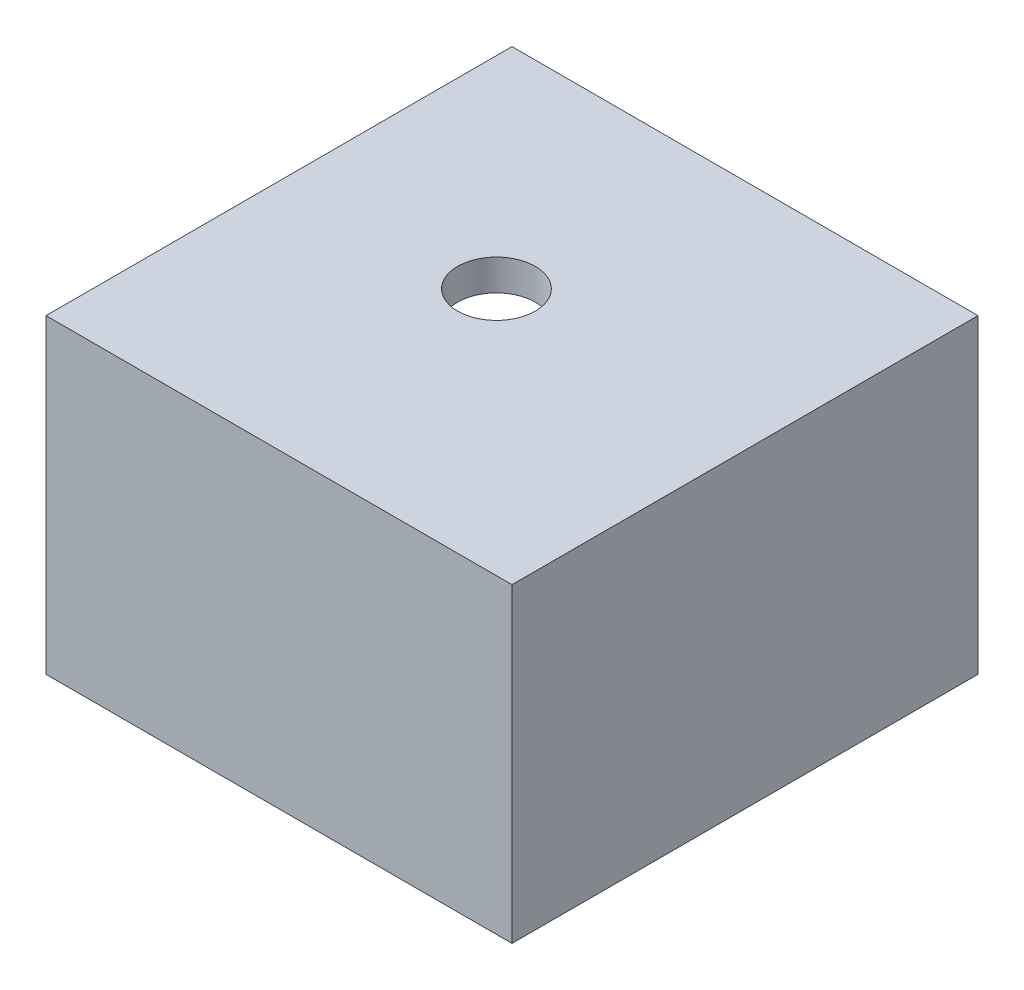
ISO-10303-21;
HEADER;
FILE_DESCRIPTION(('STEP AP214'),'2;1');
FILE_NAME('part.step','',(''),(''),'','','');
FILE_SCHEMA(('AUTOMOTIVE_DESIGN { 1 0 10303 214 1 1 1 1 }'));
ENDSEC;
DATA;
#1=APPLICATION_CONTEXT('core data for automotive mechanical design processes');
#2=APPLICATION_PROTOCOL_DEFINITION('international standard','automotive_design',2000,#1);
#3=PRODUCT_CONTEXT('',#1,'mechanical');
#4=PRODUCT('Part','Part','',(#3));
#5=PRODUCT_RELATED_PRODUCT_CATEGORY('part','',(#4));
#6=PRODUCT_DEFINITION_FORMATION('','',#4);
#7=PRODUCT_DEFINITION_CONTEXT('part definition',#1,'design');
#8=PRODUCT_DEFINITION('design','',#6,#7);
#9=PRODUCT_DEFINITION_SHAPE('','',#8);
#10=(LENGTH_UNIT() NAMED_UNIT(*) SI_UNIT(.MILLI.,.METRE.));
#11=(NAMED_UNIT(*) PLANE_ANGLE_UNIT() SI_UNIT($,.RADIAN.));
#12=(NAMED_UNIT(*) SI_UNIT($,.STERADIAN.) SOLID_ANGLE_UNIT());
#13=UNCERTAINTY_MEASURE_WITH_UNIT(LENGTH_MEASURE(1.E-05),#10,'distance_accuracy_value','');
#14=(GEOMETRIC_REPRESENTATION_CONTEXT(3) GLOBAL_UNCERTAINTY_ASSIGNED_CONTEXT((#13)) GLOBAL_UNIT_ASSIGNED_CONTEXT((#10,
#11,#12)) REPRESENTATION_CONTEXT('',''));
#15=CARTESIAN_POINT('',(0.,0.,0.));
#16=DIRECTION('',(0.,0.,1.));
#17=DIRECTION('',(1.,0.,0.));
#18=AXIS2_PLACEMENT_3D('',#15,#16,#17);
#19=CARTESIAN_POINT('',(-15.,10.,15.));
#20=DIRECTION('',(1.,0.,0.));
#21=DIRECTION('',(0.,0.,-1.));
#22=AXIS2_PLACEMENT_3D('',#19,#20,#21);
#23=PLANE('',#22);
#24=DIRECTION('',(0.,0.,1.));
#25=VECTOR('',#24,1.);
#26=CARTESIAN_POINT('',(-15.,-8.,15.));
#27=LINE('',#26,#25);
#28=CARTESIAN_POINT('',(-15.,-8.,-15.));
#29=VERTEX_POINT('',#28);
#30=CARTESIAN_POINT('',(-15.,-8.,8.));
#31=VERTEX_POINT('',#30);
#32=EDGE_CURVE('E123',#29,#31,#27,.T.);
#33=ORIENTED_EDGE('',*,*,#32,.F.);
#34=DIRECTION('',(0.,-1.,0.));
#35=VECTOR('',#34,1.);
#36=CARTESIAN_POINT('',(-15.,10.,-15.));
#37=LINE('',#36,#35);
#38=CARTESIAN_POINT('',(-15.,-10.,-15.));
#39=VERTEX_POINT('',#38);
#40=EDGE_CURVE('E141',#29,#39,#37,.T.);
#41=ORIENTED_EDGE('',*,*,#40,.T.);
#42=DIRECTION('',(0.,0.,1.));
#43=VECTOR('',#42,1.);
#44=CARTESIAN_POINT('',(-15.,-10.,15.));
#45=LINE('',#44,#43);
#46=CARTESIAN_POINT('',(-15.,-10.,15.));
#47=VERTEX_POINT('',#46);
#48=EDGE_CURVE('E126',#39,#47,#45,.T.);
#49=ORIENTED_EDGE('',*,*,#48,.T.);
#50=DIRECTION('',(0.,-1.,0.));
#51=VECTOR('',#50,1.);
#52=CARTESIAN_POINT('',(-15.,10.,15.));
#53=LINE('',#52,#51);
#54=CARTESIAN_POINT('',(-15.,10.,15.));
#55=VERTEX_POINT('',#54);
#56=EDGE_CURVE('E157',#55,#47,#53,.T.);
#57=ORIENTED_EDGE('',*,*,#56,.F.);
#58=DIRECTION('',(0.,0.,1.));
#59=VECTOR('',#58,1.);
#60=CARTESIAN_POINT('',(-15.,10.,15.));
#61=LINE('',#60,#59);
#62=CARTESIAN_POINT('',(-15.,10.,-15.));
#63=VERTEX_POINT('',#62);
#64=EDGE_CURVE('E131',#63,#55,#61,.T.);
#65=ORIENTED_EDGE('',*,*,#64,.F.);
#66=CARTESIAN_POINT('',(-15.,8.,-15.));
#67=VERTEX_POINT('',#66);
#68=EDGE_CURVE('E122',#63,#67,#37,.T.);
#69=ORIENTED_EDGE('',*,*,#68,.T.);
#70=DIRECTION('',(0.,0.,1.));
#71=VECTOR('',#70,1.);
#72=CARTESIAN_POINT('',(-15.,8.,15.));
#73=LINE('',#72,#71);
#74=CARTESIAN_POINT('',(-15.,8.,8.));
#75=VERTEX_POINT('',#74);
#76=EDGE_CURVE('E104',#67,#75,#73,.T.);
#77=ORIENTED_EDGE('',*,*,#76,.T.);
#78=DIRECTION('',(0.,1.,0.));
#79=VECTOR('',#78,1.);
#80=CARTESIAN_POINT('',(-15.,10.,8.));
#81=LINE('',#80,#79);
#82=EDGE_CURVE('E110',#31,#75,#81,.T.);
#83=ORIENTED_EDGE('',*,*,#82,.F.);
#84=EDGE_LOOP('',(#33,#41,#49,#57,#65,#69,#77,#83));
#85=FACE_BOUND('',#84,.T.);
#86=ADVANCED_FACE('F32',(#85),#23,.F.);
#87=CARTESIAN_POINT('',(15.,10.,-15.));
#88=DIRECTION('',(0.,0.,1.));
#89=DIRECTION('',(1.,0.,0.));
#90=AXIS2_PLACEMENT_3D('',#87,#88,#89);
#91=PLANE('',#90);
#92=DIRECTION('',(-1.,0.,0.));
#93=VECTOR('',#92,1.);
#94=CARTESIAN_POINT('',(15.,-8.,-15.));
#95=LINE('',#94,#93);
#96=CARTESIAN_POINT('',(8.,-8.,-15.));
#97=VERTEX_POINT('',#96);
#98=EDGE_CURVE('E117',#97,#29,#95,.T.);
#99=ORIENTED_EDGE('',*,*,#98,.F.);
#100=DIRECTION('',(0.,1.,0.));
#101=VECTOR('',#100,1.);
#102=CARTESIAN_POINT('',(8.,10.,-15.));
#103=LINE('',#102,#101);
#104=CARTESIAN_POINT('',(8.,8.,-15.));
#105=VERTEX_POINT('',#104);
#106=EDGE_CURVE('E162',#97,#105,#103,.T.);
#107=ORIENTED_EDGE('',*,*,#106,.T.);
#108=DIRECTION('',(-1.,0.,0.));
#109=VECTOR('',#108,1.);
#110=CARTESIAN_POINT('',(15.,8.,-15.));
#111=LINE('',#110,#109);
#112=EDGE_CURVE('E160',#105,#67,#111,.T.);
#113=ORIENTED_EDGE('',*,*,#112,.T.);
#114=ORIENTED_EDGE('',*,*,#68,.F.);
#115=DIRECTION('',(-1.,0.,0.));
#116=VECTOR('',#115,1.);
#117=CARTESIAN_POINT('',(15.,10.,-15.));
#118=LINE('',#117,#116);
#119=CARTESIAN_POINT('',(15.,10.,-15.));
#120=VERTEX_POINT('',#119);
#121=EDGE_CURVE('E139',#120,#63,#118,.T.);
#122=ORIENTED_EDGE('',*,*,#121,.F.);
#123=DIRECTION('',(0.,-1.,0.));
#124=VECTOR('',#123,1.);
#125=CARTESIAN_POINT('',(15.,10.,-15.));
#126=LINE('',#125,#124);
#127=CARTESIAN_POINT('',(15.,-10.,-15.));
#128=VERTEX_POINT('',#127);
#129=EDGE_CURVE('E151',#120,#128,#126,.T.);
#130=ORIENTED_EDGE('',*,*,#129,.T.);
#131=DIRECTION('',(-1.,0.,0.));
#132=VECTOR('',#131,1.);
#133=CARTESIAN_POINT('',(15.,-10.,-15.));
#134=LINE('',#133,#132);
#135=EDGE_CURVE('E135',#128,#39,#134,.T.);
#136=ORIENTED_EDGE('',*,*,#135,.T.);
#137=ORIENTED_EDGE('',*,*,#40,.F.);
#138=EDGE_LOOP('',(#99,#107,#113,#114,#122,#130,#136,#137));
#139=FACE_BOUND('',#138,.T.);
#140=ADVANCED_FACE('F209',(#139),#91,.F.);
#141=CARTESIAN_POINT('',(15.,10.,15.));
#142=DIRECTION('',(0.,0.,-1.));
#143=DIRECTION('',(-1.,0.,0.));
#144=AXIS2_PLACEMENT_3D('',#141,#142,#143);
#145=PLANE('',#144);
#146=DIRECTION('',(1.,0.,0.));
#147=VECTOR('',#146,1.);
#148=CARTESIAN_POINT('',(15.,-10.,15.));
#149=LINE('',#148,#147);
#150=CARTESIAN_POINT('',(15.,-10.,15.));
#151=VERTEX_POINT('',#150);
#152=EDGE_CURVE('E144',#47,#151,#149,.T.);
#153=ORIENTED_EDGE('',*,*,#152,.T.);
#154=DIRECTION('',(0.,-1.,0.));
#155=VECTOR('',#154,1.);
#156=CARTESIAN_POINT('',(15.,10.,15.));
#157=LINE('',#156,#155);
#158=CARTESIAN_POINT('',(15.,10.,15.));
#159=VERTEX_POINT('',#158);
#160=EDGE_CURVE('E154',#159,#151,#157,.T.);
#161=ORIENTED_EDGE('',*,*,#160,.F.);
#162=DIRECTION('',(1.,0.,0.));
#163=VECTOR('',#162,1.);
#164=CARTESIAN_POINT('',(15.,10.,15.));
#165=LINE('',#164,#163);
#166=EDGE_CURVE('E134',#55,#159,#165,.T.);
#167=ORIENTED_EDGE('',*,*,#166,.F.);
#168=ORIENTED_EDGE('',*,*,#56,.T.);
#169=EDGE_LOOP('',(#153,#161,#167,#168));
#170=FACE_BOUND('',#169,.T.);
#171=ADVANCED_FACE('F201',(#170),#145,.F.);
#172=CARTESIAN_POINT('',(15.,10.,15.));
#173=DIRECTION('',(-1.,0.,0.));
#174=DIRECTION('',(0.,0.,1.));
#175=AXIS2_PLACEMENT_3D('',#172,#173,#174);
#176=PLANE('',#175);
#177=DIRECTION('',(0.,0.,-1.));
#178=VECTOR('',#177,1.);
#179=CARTESIAN_POINT('',(15.,-10.,15.));
#180=LINE('',#179,#178);
#181=EDGE_CURVE('E146',#151,#128,#180,.T.);
#182=ORIENTED_EDGE('',*,*,#181,.T.);
#183=ORIENTED_EDGE('',*,*,#129,.F.);
#184=DIRECTION('',(0.,0.,-1.));
#185=VECTOR('',#184,1.);
#186=CARTESIAN_POINT('',(15.,10.,15.));
#187=LINE('',#186,#185);
#188=EDGE_CURVE('E137',#159,#120,#187,.T.);
#189=ORIENTED_EDGE('',*,*,#188,.F.);
#190=ORIENTED_EDGE('',*,*,#160,.T.);
#191=EDGE_LOOP('',(#182,#183,#189,#190));
#192=FACE_BOUND('',#191,.T.);
#193=ADVANCED_FACE('F194',(#192),#176,.F.);
#194=CARTESIAN_POINT('',(0.,10.,0.));
#195=DIRECTION('',(0.,1.,0.));
#196=DIRECTION('',(0.,0.,1.));
#197=AXIS2_PLACEMENT_3D('',#194,#195,#196);
#198=PLANE('',#197);
#199=CARTESIAN_POINT('',(-2.00000000000004,10.,-1.00000000000001));
#200=DIRECTION('',(0.,1.,0.));
#201=DIRECTION('',(0.,0.,1.));
#202=AXIS2_PLACEMENT_3D('',#199,#200,#201);
#203=CIRCLE('',#202,2.5);
#204=CARTESIAN_POINT('',(-2.00000000000004,10.,1.49999999999999));
#205=VERTEX_POINT('',#204);
#206=EDGE_CURVE('E183',#205,#205,#203,.T.);
#207=ORIENTED_EDGE('',*,*,#206,.F.);
#208=EDGE_LOOP('',(#207));
#209=FACE_BOUND('',#208,.T.);
#210=ORIENTED_EDGE('',*,*,#64,.T.);
#211=ORIENTED_EDGE('',*,*,#166,.T.);
#212=ORIENTED_EDGE('',*,*,#188,.T.);
#213=ORIENTED_EDGE('',*,*,#121,.T.);
#214=EDGE_LOOP('',(#210,#211,#212,#213));
#215=FACE_BOUND('',#214,.T.);
#216=ADVANCED_FACE('F190',(#209,#215),#198,.T.);
#217=CARTESIAN_POINT('',(0.,-10.,0.));
#218=DIRECTION('',(0.,1.,0.));
#219=DIRECTION('',(0.,0.,1.));
#220=AXIS2_PLACEMENT_3D('',#217,#218,#219);
#221=PLANE('',#220);
#222=CARTESIAN_POINT('',(-2.00000000000004,-10.,-1.00000000000001));
#223=DIRECTION('',(0.,1.,0.));
#224=DIRECTION('',(0.,0.,1.));
#225=AXIS2_PLACEMENT_3D('',#222,#223,#224);
#226=CIRCLE('',#225,2.5);
#227=CARTESIAN_POINT('',(-2.00000000000004,-10.,1.49999999999999));
#228=VERTEX_POINT('',#227);
#229=EDGE_CURVE('E180',#228,#228,#226,.T.);
#230=ORIENTED_EDGE('',*,*,#229,.T.);
#231=EDGE_LOOP('',(#230));
#232=FACE_BOUND('',#231,.T.);
#233=ORIENTED_EDGE('',*,*,#48,.F.);
#234=ORIENTED_EDGE('',*,*,#135,.F.);
#235=ORIENTED_EDGE('',*,*,#181,.F.);
#236=ORIENTED_EDGE('',*,*,#152,.F.);
#237=EDGE_LOOP('',(#233,#234,#235,#236));
#238=FACE_BOUND('',#237,.T.);
#239=ADVANCED_FACE('F193',(#232,#238),#221,.F.);
#240=CARTESIAN_POINT('',(0.,-8.,8.));
#241=DIRECTION('',(0.,0.,-1.));
#242=DIRECTION('',(-1.,0.,0.));
#243=AXIS2_PLACEMENT_3D('',#240,#241,#242);
#244=PLANE('',#243);
#245=DIRECTION('',(-1.,0.,0.));
#246=VECTOR('',#245,1.);
#247=CARTESIAN_POINT('',(0.,8.,8.));
#248=LINE('',#247,#246);
#249=CARTESIAN_POINT('',(7.,8.,8.));
#250=VERTEX_POINT('',#249);
#251=EDGE_CURVE('E99',#250,#75,#248,.T.);
#252=ORIENTED_EDGE('',*,*,#251,.F.);
#253=DIRECTION('',(0.,1.,0.));
#254=VECTOR('',#253,1.);
#255=CARTESIAN_POINT('',(7.,-8.,8.));
#256=LINE('',#255,#254);
#257=CARTESIAN_POINT('',(7.,-8.,8.));
#258=VERTEX_POINT('',#257);
#259=EDGE_CURVE('E41',#250,#258,#256,.F.);
#260=ORIENTED_EDGE('',*,*,#259,.T.);
#261=DIRECTION('',(-1.,0.,0.));
#262=VECTOR('',#261,1.);
#263=CARTESIAN_POINT('',(0.,-8.,8.));
#264=LINE('',#263,#262);
#265=EDGE_CURVE('E112',#258,#31,#264,.T.);
#266=ORIENTED_EDGE('',*,*,#265,.T.);
#267=ORIENTED_EDGE('',*,*,#82,.T.);
#268=EDGE_LOOP('',(#252,#260,#266,#267));
#269=FACE_BOUND('',#268,.T.);
#270=ADVANCED_FACE('F111',(#269),#244,.T.);
#271=CARTESIAN_POINT('',(8.,-8.,0.));
#272=DIRECTION('',(1.,0.,0.));
#273=DIRECTION('',(0.,0.,-1.));
#274=AXIS2_PLACEMENT_3D('',#271,#272,#273);
#275=PLANE('',#274);
#276=DIRECTION('',(0.,0.,-1.));
#277=VECTOR('',#276,1.);
#278=CARTESIAN_POINT('',(8.,-8.,0.));
#279=LINE('',#278,#277);
#280=CARTESIAN_POINT('',(8.,-8.,7.));
#281=VERTEX_POINT('',#280);
#282=EDGE_CURVE('E124',#281,#97,#279,.T.);
#283=ORIENTED_EDGE('',*,*,#282,.F.);
#284=DIRECTION('',(0.,1.,0.));
#285=VECTOR('',#284,1.);
#286=CARTESIAN_POINT('',(8.,-8.,7.));
#287=LINE('',#286,#285);
#288=CARTESIAN_POINT('',(8.,8.,7.));
#289=VERTEX_POINT('',#288);
#290=EDGE_CURVE('E116',#281,#289,#287,.T.);
#291=ORIENTED_EDGE('',*,*,#290,.T.);
#292=DIRECTION('',(0.,0.,-1.));
#293=VECTOR('',#292,1.);
#294=CARTESIAN_POINT('',(8.,8.,0.));
#295=LINE('',#294,#293);
#296=EDGE_CURVE('E106',#289,#105,#295,.T.);
#297=ORIENTED_EDGE('',*,*,#296,.T.);
#298=ORIENTED_EDGE('',*,*,#106,.F.);
#299=EDGE_LOOP('',(#283,#291,#297,#298));
#300=FACE_BOUND('',#299,.T.);
#301=ADVANCED_FACE('F172',(#300),#275,.F.);
#302=CARTESIAN_POINT('',(0.,-8.,0.));
#303=DIRECTION('',(0.,1.,0.));
#304=DIRECTION('',(0.,0.,1.));
#305=AXIS2_PLACEMENT_3D('',#302,#303,#304);
#306=PLANE('',#305);
#307=CARTESIAN_POINT('',(-2.00000000000004,-8.,-1.00000000000001));
#308=DIRECTION('',(0.,1.,0.));
#309=DIRECTION('',(0.,0.,1.));
#310=AXIS2_PLACEMENT_3D('',#307,#308,#309);
#311=CIRCLE('',#310,2.5);
#312=CARTESIAN_POINT('',(-2.00000000000004,-8.,1.49999999999999));
#313=VERTEX_POINT('',#312);
#314=EDGE_CURVE('E107',#313,#313,#311,.T.);
#315=ORIENTED_EDGE('',*,*,#314,.F.);
#316=EDGE_LOOP('',(#315));
#317=FACE_BOUND('',#316,.T.);
#318=ORIENTED_EDGE('',*,*,#265,.F.);
#319=CARTESIAN_POINT('',(7.,-8.,7.));
#320=DIRECTION('',(0.,1.,0.));
#321=DIRECTION('',(0.,0.,1.));
#322=AXIS2_PLACEMENT_3D('',#319,#320,#321);
#323=CIRCLE('',#322,1.);
#324=EDGE_CURVE('E11',#258,#281,#323,.T.);
#325=ORIENTED_EDGE('',*,*,#324,.T.);
#326=ORIENTED_EDGE('',*,*,#282,.T.);
#327=ORIENTED_EDGE('',*,*,#98,.T.);
#328=ORIENTED_EDGE('',*,*,#32,.T.);
#329=EDGE_LOOP('',(#318,#325,#326,#327,#328));
#330=FACE_BOUND('',#329,.T.);
#331=ADVANCED_FACE('F212',(#317,#330),#306,.T.);
#332=CARTESIAN_POINT('',(0.,8.,0.));
#333=DIRECTION('',(0.,1.,0.));
#334=DIRECTION('',(0.,0.,1.));
#335=AXIS2_PLACEMENT_3D('',#332,#333,#334);
#336=PLANE('',#335);
#337=CARTESIAN_POINT('',(-2.00000000000004,8.,-1.00000000000001));
#338=DIRECTION('',(0.,1.,0.));
#339=DIRECTION('',(0.,0.,1.));
#340=AXIS2_PLACEMENT_3D('',#337,#338,#339);
#341=CIRCLE('',#340,2.5);
#342=CARTESIAN_POINT('',(-2.00000000000004,8.,1.49999999999999));
#343=VERTEX_POINT('',#342);
#344=EDGE_CURVE('E36',#343,#343,#341,.T.);
#345=ORIENTED_EDGE('',*,*,#344,.T.);
#346=EDGE_LOOP('',(#345));
#347=FACE_BOUND('',#346,.T.);
#348=ORIENTED_EDGE('',*,*,#296,.F.);
#349=CARTESIAN_POINT('',(7.,8.,7.));
#350=DIRECTION('',(0.,1.,0.));
#351=DIRECTION('',(0.,0.,1.));
#352=AXIS2_PLACEMENT_3D('',#349,#350,#351);
#353=CIRCLE('',#352,1.);
#354=EDGE_CURVE('E55',#289,#250,#353,.F.);
#355=ORIENTED_EDGE('',*,*,#354,.T.);
#356=ORIENTED_EDGE('',*,*,#251,.T.);
#357=ORIENTED_EDGE('',*,*,#76,.F.);
#358=ORIENTED_EDGE('',*,*,#112,.F.);
#359=EDGE_LOOP('',(#348,#355,#356,#357,#358));
#360=FACE_BOUND('',#359,.T.);
#361=ADVANCED_FACE('F101',(#347,#360),#336,.F.);
#362=CARTESIAN_POINT('',(7.,-8.,7.));
#363=DIRECTION('',(0.,1.,0.));
#364=DIRECTION('',(0.,0.,1.));
#365=AXIS2_PLACEMENT_3D('',#362,#363,#364);
#366=CYLINDRICAL_SURFACE('',#365,1.);
#367=ORIENTED_EDGE('',*,*,#324,.F.);
#368=ORIENTED_EDGE('',*,*,#259,.F.);
#369=ORIENTED_EDGE('',*,*,#354,.F.);
#370=ORIENTED_EDGE('',*,*,#290,.F.);
#371=EDGE_LOOP('',(#367,#368,#369,#370));
#372=FACE_BOUND('',#371,.T.);
#373=ADVANCED_FACE('F34',(#372),#366,.F.);
#374=CARTESIAN_POINT('',(-2.00000000000004,-10.,-1.00000000000001));
#375=DIRECTION('',(0.,1.,0.));
#376=DIRECTION('',(0.,0.,1.));
#377=AXIS2_PLACEMENT_3D('',#374,#375,#376);
#378=CYLINDRICAL_SURFACE('',#377,2.5);
#379=ORIENTED_EDGE('',*,*,#206,.T.);
#380=EDGE_LOOP('',(#379));
#381=FACE_BOUND('',#380,.T.);
#382=ORIENTED_EDGE('',*,*,#344,.F.);
#383=EDGE_LOOP('',(#382));
#384=FACE_BOUND('',#383,.T.);
#385=ADVANCED_FACE('F187',(#381,#384),#378,.F.);
#386=ORIENTED_EDGE('',*,*,#314,.T.);
#387=EDGE_LOOP('',(#386));
#388=FACE_BOUND('',#387,.T.);
#389=ORIENTED_EDGE('',*,*,#229,.F.);
#390=EDGE_LOOP('',(#389));
#391=FACE_BOUND('',#390,.T.);
#392=ADVANCED_FACE('F278',(#388,#391),#378,.F.);
#393=CLOSED_SHELL('',(#86,#140,#171,#193,#216,#239,#270,#301,#331,#361,#373,#385,#392));
#394=MANIFOLD_SOLID_BREP('B2',#393);
#395=ADVANCED_BREP_SHAPE_REPRESENTATION('',(#18,#394),#14);
#396=SHAPE_DEFINITION_REPRESENTATION(#9,#395);
ENDSEC;
END-ISO-10303-21;
